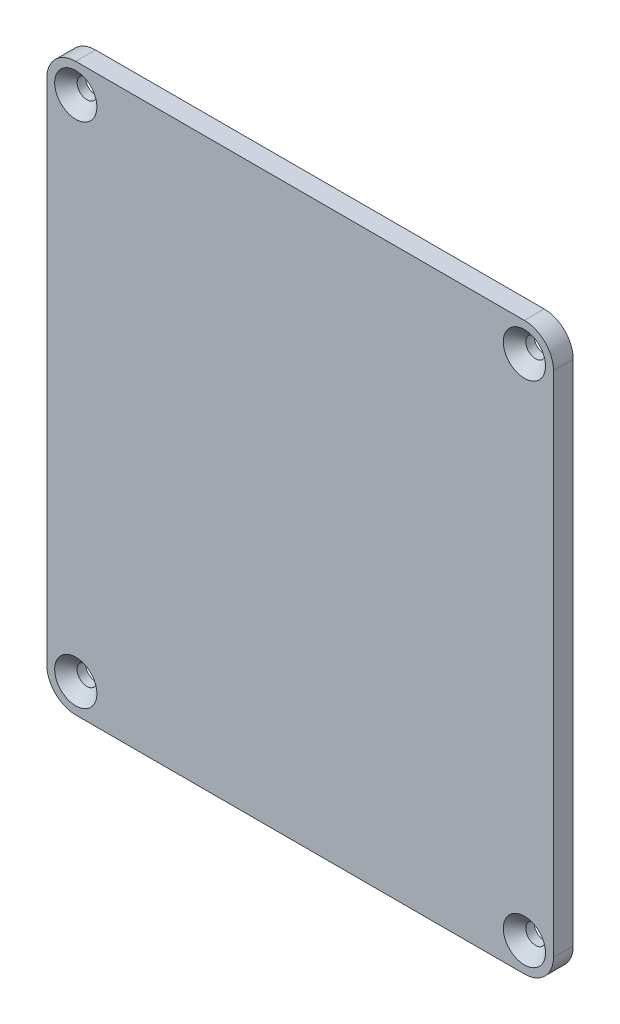
ISO-10303-21;
HEADER;
FILE_DESCRIPTION(('STEP AP214'),'2;1');
FILE_NAME('part.step','',(''),(''),'','','');
FILE_SCHEMA(('AUTOMOTIVE_DESIGN { 1 0 10303 214 1 1 1 1 }'));
ENDSEC;
DATA;
#1=APPLICATION_CONTEXT('core data for automotive mechanical design processes');
#2=APPLICATION_PROTOCOL_DEFINITION('international standard','automotive_design',2000,#1);
#3=PRODUCT_CONTEXT('',#1,'mechanical');
#4=PRODUCT('Part','Part','',(#3));
#5=PRODUCT_RELATED_PRODUCT_CATEGORY('part','',(#4));
#6=PRODUCT_DEFINITION_FORMATION('','',#4);
#7=PRODUCT_DEFINITION_CONTEXT('part definition',#1,'design');
#8=PRODUCT_DEFINITION('design','',#6,#7);
#9=PRODUCT_DEFINITION_SHAPE('','',#8);
#10=(LENGTH_UNIT() NAMED_UNIT(*) SI_UNIT(.MILLI.,.METRE.));
#11=(NAMED_UNIT(*) PLANE_ANGLE_UNIT() SI_UNIT($,.RADIAN.));
#12=(NAMED_UNIT(*) SI_UNIT($,.STERADIAN.) SOLID_ANGLE_UNIT());
#13=UNCERTAINTY_MEASURE_WITH_UNIT(LENGTH_MEASURE(1.E-05),#10,'distance_accuracy_value','');
#14=(GEOMETRIC_REPRESENTATION_CONTEXT(3) GLOBAL_UNCERTAINTY_ASSIGNED_CONTEXT((#13)) GLOBAL_UNIT_ASSIGNED_CONTEXT((#10,
#11,#12)) REPRESENTATION_CONTEXT('',''));
#15=CARTESIAN_POINT('',(0.,0.,0.));
#16=DIRECTION('',(0.,0.,1.));
#17=DIRECTION('',(1.,0.,0.));
#18=AXIS2_PLACEMENT_3D('',#15,#16,#17);
#19=CARTESIAN_POINT('',(34.,-38.5,3.));
#20=DIRECTION('',(0.,0.,1.));
#21=DIRECTION('',(1.,0.,0.));
#22=AXIS2_PLACEMENT_3D('',#19,#20,#21);
#23=PLANE('',#22);
#24=CARTESIAN_POINT('',(34.,-38.5,3.));
#25=DIRECTION('',(0.,0.,1.));
#26=DIRECTION('',(1.,0.,0.));
#27=AXIS2_PLACEMENT_3D('',#24,#25,#26);
#28=CIRCLE('',#27,3.20000000000001);
#29=CARTESIAN_POINT('',(37.2,-38.5,3.));
#30=VERTEX_POINT('',#29);
#31=EDGE_CURVE('E197',#30,#30,#28,.F.);
#32=ORIENTED_EDGE('',*,*,#31,.T.);
#33=EDGE_LOOP('',(#32));
#34=FACE_BOUND('',#33,.T.);
#35=CARTESIAN_POINT('',(34.,38.5,3.));
#36=DIRECTION('',(0.,0.,1.));
#37=DIRECTION('',(1.,0.,0.));
#38=AXIS2_PLACEMENT_3D('',#35,#36,#37);
#39=CIRCLE('',#38,3.20000000000001);
#40=CARTESIAN_POINT('',(37.2,38.5,3.));
#41=VERTEX_POINT('',#40);
#42=EDGE_CURVE('E193',#41,#41,#39,.F.);
#43=ORIENTED_EDGE('',*,*,#42,.T.);
#44=EDGE_LOOP('',(#43));
#45=FACE_BOUND('',#44,.T.);
#46=CARTESIAN_POINT('',(-34.,38.5,3.));
#47=DIRECTION('',(0.,0.,1.));
#48=DIRECTION('',(1.,0.,0.));
#49=AXIS2_PLACEMENT_3D('',#46,#47,#48);
#50=CIRCLE('',#49,3.20000000000001);
#51=CARTESIAN_POINT('',(-30.8,38.5,3.));
#52=VERTEX_POINT('',#51);
#53=EDGE_CURVE('E189',#52,#52,#50,.F.);
#54=ORIENTED_EDGE('',*,*,#53,.T.);
#55=EDGE_LOOP('',(#54));
#56=FACE_BOUND('',#55,.T.);
#57=CARTESIAN_POINT('',(-34.,-38.5,3.));
#58=DIRECTION('',(0.,0.,1.));
#59=DIRECTION('',(1.,0.,0.));
#60=AXIS2_PLACEMENT_3D('',#57,#58,#59);
#61=CIRCLE('',#60,3.20000000000001);
#62=CARTESIAN_POINT('',(-30.8,-38.5,3.));
#63=VERTEX_POINT('',#62);
#64=EDGE_CURVE('E186',#63,#63,#61,.F.);
#65=ORIENTED_EDGE('',*,*,#64,.T.);
#66=EDGE_LOOP('',(#65));
#67=FACE_BOUND('',#66,.T.);
#68=CARTESIAN_POINT('',(34.,-38.5,3.));
#69=DIRECTION('',(0.,0.,1.));
#70=DIRECTION('',(1.,0.,0.));
#71=AXIS2_PLACEMENT_3D('',#68,#69,#70);
#72=CIRCLE('',#71,4.39999999999999);
#73=CARTESIAN_POINT('',(34.,-42.9,3.));
#74=VERTEX_POINT('',#73);
#75=CARTESIAN_POINT('',(38.4,-38.5,3.));
#76=VERTEX_POINT('',#75);
#77=EDGE_CURVE('E166',#74,#76,#72,.T.);
#78=ORIENTED_EDGE('',*,*,#77,.T.);
#79=DIRECTION('',(0.,1.,0.));
#80=VECTOR('',#79,1.);
#81=CARTESIAN_POINT('',(38.4,-38.5,3.));
#82=LINE('',#81,#80);
#83=CARTESIAN_POINT('',(38.4,38.5,3.));
#84=VERTEX_POINT('',#83);
#85=EDGE_CURVE('E107',#76,#84,#82,.T.);
#86=ORIENTED_EDGE('',*,*,#85,.T.);
#87=CARTESIAN_POINT('',(34.,38.5,3.));
#88=DIRECTION('',(0.,0.,1.));
#89=DIRECTION('',(1.,0.,0.));
#90=AXIS2_PLACEMENT_3D('',#87,#88,#89);
#91=CIRCLE('',#90,4.39999999999999);
#92=CARTESIAN_POINT('',(34.,42.9,3.));
#93=VERTEX_POINT('',#92);
#94=EDGE_CURVE('E302',#84,#93,#91,.T.);
#95=ORIENTED_EDGE('',*,*,#94,.T.);
#96=DIRECTION('',(-1.,0.,0.));
#97=VECTOR('',#96,1.);
#98=CARTESIAN_POINT('',(34.,42.9,3.));
#99=LINE('',#98,#97);
#100=CARTESIAN_POINT('',(-34.,42.9,3.));
#101=VERTEX_POINT('',#100);
#102=EDGE_CURVE('E305',#93,#101,#99,.T.);
#103=ORIENTED_EDGE('',*,*,#102,.T.);
#104=CARTESIAN_POINT('',(-34.,38.5,3.));
#105=DIRECTION('',(0.,0.,1.));
#106=DIRECTION('',(1.,0.,0.));
#107=AXIS2_PLACEMENT_3D('',#104,#105,#106);
#108=CIRCLE('',#107,4.39999999999999);
#109=CARTESIAN_POINT('',(-38.4,38.5,3.));
#110=VERTEX_POINT('',#109);
#111=EDGE_CURVE('E127',#101,#110,#108,.T.);
#112=ORIENTED_EDGE('',*,*,#111,.T.);
#113=DIRECTION('',(0.,-1.,0.));
#114=VECTOR('',#113,1.);
#115=CARTESIAN_POINT('',(-38.4,38.5,3.));
#116=LINE('',#115,#114);
#117=CARTESIAN_POINT('',(-38.4,-38.5,3.));
#118=VERTEX_POINT('',#117);
#119=EDGE_CURVE('E122',#110,#118,#116,.T.);
#120=ORIENTED_EDGE('',*,*,#119,.T.);
#121=CARTESIAN_POINT('',(-34.,-38.5,3.));
#122=DIRECTION('',(0.,0.,1.));
#123=DIRECTION('',(1.,0.,0.));
#124=AXIS2_PLACEMENT_3D('',#121,#122,#123);
#125=CIRCLE('',#124,4.39999999999999);
#126=CARTESIAN_POINT('',(-34.,-42.9,3.));
#127=VERTEX_POINT('',#126);
#128=EDGE_CURVE('E125',#118,#127,#125,.T.);
#129=ORIENTED_EDGE('',*,*,#128,.T.);
#130=DIRECTION('',(1.,0.,0.));
#131=VECTOR('',#130,1.);
#132=CARTESIAN_POINT('',(-34.,-42.9,3.));
#133=LINE('',#132,#131);
#134=EDGE_CURVE('E61',#127,#74,#133,.T.);
#135=ORIENTED_EDGE('',*,*,#134,.T.);
#136=EDGE_LOOP('',(#78,#86,#95,#103,#112,#120,#129,#135));
#137=FACE_BOUND('',#136,.T.);
#138=ADVANCED_FACE('F43',(#34,#45,#56,#67,#137),#23,.T.);
#139=CARTESIAN_POINT('',(34.,-38.5,0.));
#140=DIRECTION('',(0.,0.,1.));
#141=DIRECTION('',(1.,0.,0.));
#142=AXIS2_PLACEMENT_3D('',#139,#140,#141);
#143=PLANE('',#142);
#144=CARTESIAN_POINT('',(34.,-38.5,0.));
#145=DIRECTION('',(0.,0.,1.));
#146=DIRECTION('',(1.,0.,0.));
#147=AXIS2_PLACEMENT_3D('',#144,#145,#146);
#148=CIRCLE('',#147,4.39999999999999);
#149=CARTESIAN_POINT('',(34.,-42.9,0.));
#150=VERTEX_POINT('',#149);
#151=CARTESIAN_POINT('',(38.4,-38.5,0.));
#152=VERTEX_POINT('',#151);
#153=EDGE_CURVE('E146',#150,#152,#148,.T.);
#154=ORIENTED_EDGE('',*,*,#153,.F.);
#155=DIRECTION('',(1.,0.,0.));
#156=VECTOR('',#155,1.);
#157=CARTESIAN_POINT('',(-34.,-42.9,0.));
#158=LINE('',#157,#156);
#159=CARTESIAN_POINT('',(-34.,-42.9,0.));
#160=VERTEX_POINT('',#159);
#161=EDGE_CURVE('E98',#160,#150,#158,.T.);
#162=ORIENTED_EDGE('',*,*,#161,.F.);
#163=CARTESIAN_POINT('',(-34.,-38.5,0.));
#164=DIRECTION('',(0.,0.,1.));
#165=DIRECTION('',(1.,0.,0.));
#166=AXIS2_PLACEMENT_3D('',#163,#164,#165);
#167=CIRCLE('',#166,4.39999999999999);
#168=CARTESIAN_POINT('',(-38.4,-38.5,0.));
#169=VERTEX_POINT('',#168);
#170=EDGE_CURVE('E92',#169,#160,#167,.T.);
#171=ORIENTED_EDGE('',*,*,#170,.F.);
#172=DIRECTION('',(0.,-1.,0.));
#173=VECTOR('',#172,1.);
#174=CARTESIAN_POINT('',(-38.4,38.5,0.));
#175=LINE('',#174,#173);
#176=CARTESIAN_POINT('',(-38.4,38.5,0.));
#177=VERTEX_POINT('',#176);
#178=EDGE_CURVE('E135',#177,#169,#175,.T.);
#179=ORIENTED_EDGE('',*,*,#178,.F.);
#180=CARTESIAN_POINT('',(-34.,38.5,0.));
#181=DIRECTION('',(0.,0.,1.));
#182=DIRECTION('',(1.,0.,0.));
#183=AXIS2_PLACEMENT_3D('',#180,#181,#182);
#184=CIRCLE('',#183,4.39999999999999);
#185=CARTESIAN_POINT('',(-34.,42.9,0.));
#186=VERTEX_POINT('',#185);
#187=EDGE_CURVE('E159',#186,#177,#184,.T.);
#188=ORIENTED_EDGE('',*,*,#187,.F.);
#189=DIRECTION('',(-1.,0.,0.));
#190=VECTOR('',#189,1.);
#191=CARTESIAN_POINT('',(34.,42.9,0.));
#192=LINE('',#191,#190);
#193=CARTESIAN_POINT('',(34.,42.9,0.));
#194=VERTEX_POINT('',#193);
#195=EDGE_CURVE('E156',#194,#186,#192,.T.);
#196=ORIENTED_EDGE('',*,*,#195,.F.);
#197=CARTESIAN_POINT('',(34.,38.5,0.));
#198=DIRECTION('',(0.,0.,1.));
#199=DIRECTION('',(1.,0.,0.));
#200=AXIS2_PLACEMENT_3D('',#197,#198,#199);
#201=CIRCLE('',#200,4.39999999999999);
#202=CARTESIAN_POINT('',(38.4,38.5,0.));
#203=VERTEX_POINT('',#202);
#204=EDGE_CURVE('E153',#203,#194,#201,.T.);
#205=ORIENTED_EDGE('',*,*,#204,.F.);
#206=DIRECTION('',(0.,1.,0.));
#207=VECTOR('',#206,1.);
#208=CARTESIAN_POINT('',(38.4,-38.5,0.));
#209=LINE('',#208,#207);
#210=EDGE_CURVE('E149',#152,#203,#209,.T.);
#211=ORIENTED_EDGE('',*,*,#210,.F.);
#212=EDGE_LOOP('',(#154,#162,#171,#179,#188,#196,#205,#211));
#213=FACE_BOUND('',#212,.T.);
#214=CARTESIAN_POINT('',(34.,-38.5,0.));
#215=DIRECTION('',(0.,0.,1.));
#216=DIRECTION('',(1.,0.,0.));
#217=AXIS2_PLACEMENT_3D('',#214,#215,#216);
#218=CIRCLE('',#217,1.5);
#219=CARTESIAN_POINT('',(35.5,-38.5,0.));
#220=VERTEX_POINT('',#219);
#221=EDGE_CURVE('E150',#220,#220,#218,.T.);
#222=ORIENTED_EDGE('',*,*,#221,.T.);
#223=EDGE_LOOP('',(#222));
#224=FACE_BOUND('',#223,.T.);
#225=CARTESIAN_POINT('',(-34.,-38.5,0.));
#226=DIRECTION('',(0.,0.,1.));
#227=DIRECTION('',(-1.,0.,0.));
#228=AXIS2_PLACEMENT_3D('',#225,#226,#227);
#229=CIRCLE('',#228,1.5);
#230=CARTESIAN_POINT('',(-35.5,-38.5,0.));
#231=VERTEX_POINT('',#230);
#232=EDGE_CURVE('E292',#231,#231,#229,.T.);
#233=ORIENTED_EDGE('',*,*,#232,.T.);
#234=EDGE_LOOP('',(#233));
#235=FACE_BOUND('',#234,.T.);
#236=CARTESIAN_POINT('',(34.,38.5,0.));
#237=DIRECTION('',(0.,0.,1.));
#238=DIRECTION('',(-1.,0.,0.));
#239=AXIS2_PLACEMENT_3D('',#236,#237,#238);
#240=CIRCLE('',#239,1.5);
#241=CARTESIAN_POINT('',(32.5,38.5,0.));
#242=VERTEX_POINT('',#241);
#243=EDGE_CURVE('E295',#242,#242,#240,.T.);
#244=ORIENTED_EDGE('',*,*,#243,.T.);
#245=EDGE_LOOP('',(#244));
#246=FACE_BOUND('',#245,.T.);
#247=CARTESIAN_POINT('',(-34.,38.5,0.));
#248=DIRECTION('',(0.,0.,1.));
#249=DIRECTION('',(1.,0.,0.));
#250=AXIS2_PLACEMENT_3D('',#247,#248,#249);
#251=CIRCLE('',#250,1.5);
#252=CARTESIAN_POINT('',(-32.5,38.5,0.));
#253=VERTEX_POINT('',#252);
#254=EDGE_CURVE('E308',#253,#253,#251,.T.);
#255=ORIENTED_EDGE('',*,*,#254,.T.);
#256=EDGE_LOOP('',(#255));
#257=FACE_BOUND('',#256,.T.);
#258=ADVANCED_FACE('F226',(#213,#224,#235,#246,#257),#143,.F.);
#259=CARTESIAN_POINT('',(34.,-38.5,3.));
#260=DIRECTION('',(0.,0.,-1.));
#261=DIRECTION('',(-1.,0.,0.));
#262=AXIS2_PLACEMENT_3D('',#259,#260,#261);
#263=CYLINDRICAL_SURFACE('',#262,4.39999999999999);
#264=ORIENTED_EDGE('',*,*,#153,.T.);
#265=DIRECTION('',(0.,0.,-1.));
#266=VECTOR('',#265,1.);
#267=CARTESIAN_POINT('',(38.4,-38.5,3.));
#268=LINE('',#267,#266);
#269=EDGE_CURVE('E181',#76,#152,#268,.T.);
#270=ORIENTED_EDGE('',*,*,#269,.F.);
#271=ORIENTED_EDGE('',*,*,#77,.F.);
#272=DIRECTION('',(0.,0.,-1.));
#273=VECTOR('',#272,1.);
#274=CARTESIAN_POINT('',(34.,-42.9,3.));
#275=LINE('',#274,#273);
#276=EDGE_CURVE('E142',#74,#150,#275,.T.);
#277=ORIENTED_EDGE('',*,*,#276,.T.);
#278=EDGE_LOOP('',(#264,#270,#271,#277));
#279=FACE_BOUND('',#278,.T.);
#280=ADVANCED_FACE('F232',(#279),#263,.T.);
#281=CARTESIAN_POINT('',(38.4,-38.5,3.));
#282=DIRECTION('',(-1.,0.,0.));
#283=DIRECTION('',(0.,0.,1.));
#284=AXIS2_PLACEMENT_3D('',#281,#282,#283);
#285=PLANE('',#284);
#286=ORIENTED_EDGE('',*,*,#210,.T.);
#287=DIRECTION('',(0.,0.,-1.));
#288=VECTOR('',#287,1.);
#289=CARTESIAN_POINT('',(38.4,38.5,3.));
#290=LINE('',#289,#288);
#291=EDGE_CURVE('E178',#84,#203,#290,.T.);
#292=ORIENTED_EDGE('',*,*,#291,.F.);
#293=ORIENTED_EDGE('',*,*,#85,.F.);
#294=ORIENTED_EDGE('',*,*,#269,.T.);
#295=EDGE_LOOP('',(#286,#292,#293,#294));
#296=FACE_BOUND('',#295,.T.);
#297=ADVANCED_FACE('F258',(#296),#285,.F.);
#298=CARTESIAN_POINT('',(34.,38.5,3.));
#299=DIRECTION('',(0.,0.,-1.));
#300=DIRECTION('',(-1.,0.,0.));
#301=AXIS2_PLACEMENT_3D('',#298,#299,#300);
#302=CYLINDRICAL_SURFACE('',#301,4.39999999999999);
#303=ORIENTED_EDGE('',*,*,#204,.T.);
#304=DIRECTION('',(0.,0.,-1.));
#305=VECTOR('',#304,1.);
#306=CARTESIAN_POINT('',(34.,42.9,3.));
#307=LINE('',#306,#305);
#308=EDGE_CURVE('E174',#93,#194,#307,.T.);
#309=ORIENTED_EDGE('',*,*,#308,.F.);
#310=ORIENTED_EDGE('',*,*,#94,.F.);
#311=ORIENTED_EDGE('',*,*,#291,.T.);
#312=EDGE_LOOP('',(#303,#309,#310,#311));
#313=FACE_BOUND('',#312,.T.);
#314=ADVANCED_FACE('F254',(#313),#302,.T.);
#315=CARTESIAN_POINT('',(34.,42.9,3.));
#316=DIRECTION('',(0.,-1.,0.));
#317=DIRECTION('',(0.,0.,-1.));
#318=AXIS2_PLACEMENT_3D('',#315,#316,#317);
#319=PLANE('',#318);
#320=ORIENTED_EDGE('',*,*,#195,.T.);
#321=DIRECTION('',(0.,0.,-1.));
#322=VECTOR('',#321,1.);
#323=CARTESIAN_POINT('',(-34.,42.9,3.));
#324=LINE('',#323,#322);
#325=EDGE_CURVE('E170',#101,#186,#324,.T.);
#326=ORIENTED_EDGE('',*,*,#325,.F.);
#327=ORIENTED_EDGE('',*,*,#102,.F.);
#328=ORIENTED_EDGE('',*,*,#308,.T.);
#329=EDGE_LOOP('',(#320,#326,#327,#328));
#330=FACE_BOUND('',#329,.T.);
#331=ADVANCED_FACE('F250',(#330),#319,.F.);
#332=CARTESIAN_POINT('',(-34.,38.5,3.));
#333=DIRECTION('',(0.,0.,-1.));
#334=DIRECTION('',(-1.,0.,0.));
#335=AXIS2_PLACEMENT_3D('',#332,#333,#334);
#336=CYLINDRICAL_SURFACE('',#335,4.39999999999999);
#337=ORIENTED_EDGE('',*,*,#187,.T.);
#338=DIRECTION('',(0.,0.,-1.));
#339=VECTOR('',#338,1.);
#340=CARTESIAN_POINT('',(-38.4,38.5,3.));
#341=LINE('',#340,#339);
#342=EDGE_CURVE('E136',#110,#177,#341,.T.);
#343=ORIENTED_EDGE('',*,*,#342,.F.);
#344=ORIENTED_EDGE('',*,*,#111,.F.);
#345=ORIENTED_EDGE('',*,*,#325,.T.);
#346=EDGE_LOOP('',(#337,#343,#344,#345));
#347=FACE_BOUND('',#346,.T.);
#348=ADVANCED_FACE('F247',(#347),#336,.T.);
#349=CARTESIAN_POINT('',(-38.4,38.5,3.));
#350=DIRECTION('',(1.,0.,0.));
#351=DIRECTION('',(0.,0.,-1.));
#352=AXIS2_PLACEMENT_3D('',#349,#350,#351);
#353=PLANE('',#352);
#354=ORIENTED_EDGE('',*,*,#178,.T.);
#355=DIRECTION('',(0.,0.,-1.));
#356=VECTOR('',#355,1.);
#357=CARTESIAN_POINT('',(-38.4,-38.5,3.));
#358=LINE('',#357,#356);
#359=EDGE_CURVE('E132',#118,#169,#358,.T.);
#360=ORIENTED_EDGE('',*,*,#359,.F.);
#361=ORIENTED_EDGE('',*,*,#119,.F.);
#362=ORIENTED_EDGE('',*,*,#342,.T.);
#363=EDGE_LOOP('',(#354,#360,#361,#362));
#364=FACE_BOUND('',#363,.T.);
#365=ADVANCED_FACE('F133',(#364),#353,.F.);
#366=CARTESIAN_POINT('',(-34.,-38.5,3.));
#367=DIRECTION('',(0.,0.,-1.));
#368=DIRECTION('',(-1.,0.,0.));
#369=AXIS2_PLACEMENT_3D('',#366,#367,#368);
#370=CYLINDRICAL_SURFACE('',#369,4.39999999999999);
#371=ORIENTED_EDGE('',*,*,#170,.T.);
#372=DIRECTION('',(0.,0.,-1.));
#373=VECTOR('',#372,1.);
#374=CARTESIAN_POINT('',(-34.,-42.9,3.));
#375=LINE('',#374,#373);
#376=EDGE_CURVE('E137',#127,#160,#375,.T.);
#377=ORIENTED_EDGE('',*,*,#376,.F.);
#378=ORIENTED_EDGE('',*,*,#128,.F.);
#379=ORIENTED_EDGE('',*,*,#359,.T.);
#380=EDGE_LOOP('',(#371,#377,#378,#379));
#381=FACE_BOUND('',#380,.T.);
#382=ADVANCED_FACE('F139',(#381),#370,.T.);
#383=CARTESIAN_POINT('',(-34.,-42.9,3.));
#384=DIRECTION('',(0.,1.,0.));
#385=DIRECTION('',(0.,0.,1.));
#386=AXIS2_PLACEMENT_3D('',#383,#384,#385);
#387=PLANE('',#386);
#388=ORIENTED_EDGE('',*,*,#161,.T.);
#389=ORIENTED_EDGE('',*,*,#276,.F.);
#390=ORIENTED_EDGE('',*,*,#134,.F.);
#391=ORIENTED_EDGE('',*,*,#376,.T.);
#392=EDGE_LOOP('',(#388,#389,#390,#391));
#393=FACE_BOUND('',#392,.T.);
#394=ADVANCED_FACE('F240',(#393),#387,.F.);
#395=CARTESIAN_POINT('',(34.,-38.5,3.));
#396=DIRECTION('',(0.,0.,-1.));
#397=DIRECTION('',(-1.,0.,0.));
#398=AXIS2_PLACEMENT_3D('',#395,#396,#397);
#399=CYLINDRICAL_SURFACE('',#398,1.5);
#400=CARTESIAN_POINT('',(34.,-38.5,1.3));
#401=DIRECTION('',(0.,0.,1.));
#402=DIRECTION('',(1.,0.,0.));
#403=AXIS2_PLACEMENT_3D('',#400,#401,#402);
#404=CIRCLE('',#403,1.5);
#405=CARTESIAN_POINT('',(35.5,-38.5,1.3));
#406=VERTEX_POINT('',#405);
#407=EDGE_CURVE('E183',#406,#406,#404,.T.);
#408=ORIENTED_EDGE('',*,*,#407,.T.);
#409=EDGE_LOOP('',(#408));
#410=FACE_BOUND('',#409,.T.);
#411=ORIENTED_EDGE('',*,*,#221,.F.);
#412=EDGE_LOOP('',(#411));
#413=FACE_BOUND('',#412,.T.);
#414=ADVANCED_FACE('F237',(#410,#413),#399,.F.);
#415=CARTESIAN_POINT('',(-34.,-38.5,3.));
#416=DIRECTION('',(0.,0.,-1.));
#417=DIRECTION('',(-1.,0.,0.));
#418=AXIS2_PLACEMENT_3D('',#415,#416,#417);
#419=CYLINDRICAL_SURFACE('',#418,1.5);
#420=CARTESIAN_POINT('',(-34.,-38.5,1.3));
#421=DIRECTION('',(0.,0.,1.));
#422=DIRECTION('',(1.,0.,0.));
#423=AXIS2_PLACEMENT_3D('',#420,#421,#422);
#424=CIRCLE('',#423,1.5);
#425=CARTESIAN_POINT('',(-32.5,-38.5,1.3));
#426=VERTEX_POINT('',#425);
#427=EDGE_CURVE('E11',#426,#426,#424,.T.);
#428=ORIENTED_EDGE('',*,*,#427,.T.);
#429=EDGE_LOOP('',(#428));
#430=FACE_BOUND('',#429,.T.);
#431=ORIENTED_EDGE('',*,*,#232,.F.);
#432=EDGE_LOOP('',(#431));
#433=FACE_BOUND('',#432,.T.);
#434=ADVANCED_FACE('F288',(#430,#433),#419,.F.);
#435=CARTESIAN_POINT('',(34.,38.5,3.));
#436=DIRECTION('',(0.,0.,-1.));
#437=DIRECTION('',(-1.,0.,0.));
#438=AXIS2_PLACEMENT_3D('',#435,#436,#437);
#439=CYLINDRICAL_SURFACE('',#438,1.5);
#440=CARTESIAN_POINT('',(34.,38.5,1.3));
#441=DIRECTION('',(0.,0.,1.));
#442=DIRECTION('',(1.,0.,0.));
#443=AXIS2_PLACEMENT_3D('',#440,#441,#442);
#444=CIRCLE('',#443,1.5);
#445=CARTESIAN_POINT('',(35.5,38.5,1.3));
#446=VERTEX_POINT('',#445);
#447=EDGE_CURVE('E200',#446,#446,#444,.T.);
#448=ORIENTED_EDGE('',*,*,#447,.T.);
#449=EDGE_LOOP('',(#448));
#450=FACE_BOUND('',#449,.T.);
#451=ORIENTED_EDGE('',*,*,#243,.F.);
#452=EDGE_LOOP('',(#451));
#453=FACE_BOUND('',#452,.T.);
#454=ADVANCED_FACE('F280',(#450,#453),#439,.F.);
#455=CARTESIAN_POINT('',(-34.,38.5,3.));
#456=DIRECTION('',(0.,0.,-1.));
#457=DIRECTION('',(-1.,0.,0.));
#458=AXIS2_PLACEMENT_3D('',#455,#456,#457);
#459=CYLINDRICAL_SURFACE('',#458,1.5);
#460=CARTESIAN_POINT('',(-34.,38.5,1.3));
#461=DIRECTION('',(0.,0.,1.));
#462=DIRECTION('',(1.,0.,0.));
#463=AXIS2_PLACEMENT_3D('',#460,#461,#462);
#464=CIRCLE('',#463,1.5);
#465=CARTESIAN_POINT('',(-32.5,38.5,1.3));
#466=VERTEX_POINT('',#465);
#467=EDGE_CURVE('E53',#466,#466,#464,.T.);
#468=ORIENTED_EDGE('',*,*,#467,.T.);
#469=EDGE_LOOP('',(#468));
#470=FACE_BOUND('',#469,.T.);
#471=ORIENTED_EDGE('',*,*,#254,.F.);
#472=EDGE_LOOP('',(#471));
#473=FACE_BOUND('',#472,.T.);
#474=ADVANCED_FACE('F208',(#470,#473),#459,.F.);
#475=CARTESIAN_POINT('',(34.,-38.5,1.3));
#476=DIRECTION('',(0.,0.,1.));
#477=DIRECTION('',(1.,0.,0.));
#478=AXIS2_PLACEMENT_3D('',#475,#476,#477);
#479=CONICAL_SURFACE('',#478,1.5,0.785398163397452);
#480=CARTESIAN_POINT('',(37.2,-38.5,3.));
#481=CARTESIAN_POINT('',(37.1822916666667,-38.5,2.98229166666667));
#482=CARTESIAN_POINT('',(37.1645833333333,-38.5,2.96458333333333));
#483=CARTESIAN_POINT('',(37.1291666666667,-38.5,2.92916666666667));
#484=CARTESIAN_POINT('',(37.1114583333333,-38.5,2.91145833333333));
#485=CARTESIAN_POINT('',(37.0760416666667,-38.5,2.87604166666667));
#486=CARTESIAN_POINT('',(37.0583333333333,-38.5,2.85833333333333));
#487=CARTESIAN_POINT('',(37.0229166666667,-38.5,2.82291666666667));
#488=CARTESIAN_POINT('',(37.0052083333333,-38.5,2.80520833333333));
#489=CARTESIAN_POINT('',(36.9697916666667,-38.5,2.76979166666667));
#490=CARTESIAN_POINT('',(36.9520833333333,-38.5,2.75208333333333));
#491=CARTESIAN_POINT('',(36.9166666666667,-38.5,2.71666666666667));
#492=CARTESIAN_POINT('',(36.8989583333333,-38.5,2.69895833333333));
#493=CARTESIAN_POINT('',(36.8635416666667,-38.5,2.66354166666667));
#494=CARTESIAN_POINT('',(36.8458333333333,-38.5,2.64583333333333));
#495=CARTESIAN_POINT('',(36.8104166666667,-38.5,2.61041666666667));
#496=CARTESIAN_POINT('',(36.7927083333333,-38.5,2.59270833333333));
#497=CARTESIAN_POINT('',(36.7572916666667,-38.5,2.55729166666667));
#498=CARTESIAN_POINT('',(36.7395833333333,-38.5,2.53958333333333));
#499=CARTESIAN_POINT('',(36.7041666666667,-38.5,2.50416666666667));
#500=CARTESIAN_POINT('',(36.6864583333333,-38.5,2.48645833333333));
#501=CARTESIAN_POINT('',(36.6510416666667,-38.5,2.45104166666667));
#502=CARTESIAN_POINT('',(36.6333333333333,-38.5,2.43333333333333));
#503=CARTESIAN_POINT('',(36.5979166666667,-38.5,2.39791666666667));
#504=CARTESIAN_POINT('',(36.5802083333333,-38.5,2.38020833333333));
#505=CARTESIAN_POINT('',(36.5447916666667,-38.5,2.34479166666667));
#506=CARTESIAN_POINT('',(36.5270833333333,-38.5,2.32708333333333));
#507=CARTESIAN_POINT('',(36.4916666666667,-38.5,2.29166666666667));
#508=CARTESIAN_POINT('',(36.4739583333333,-38.5,2.27395833333334));
#509=CARTESIAN_POINT('',(36.4385416666667,-38.5,2.23854166666667));
#510=CARTESIAN_POINT('',(36.4208333333333,-38.5,2.22083333333333));
#511=CARTESIAN_POINT('',(36.3854166666667,-38.5,2.18541666666667));
#512=CARTESIAN_POINT('',(36.3677083333333,-38.5,2.16770833333334));
#513=CARTESIAN_POINT('',(36.3322916666667,-38.5,2.13229166666667));
#514=CARTESIAN_POINT('',(36.3145833333333,-38.5,2.11458333333333));
#515=CARTESIAN_POINT('',(36.2791666666667,-38.5,2.07916666666667));
#516=CARTESIAN_POINT('',(36.2614583333333,-38.5,2.06145833333334));
#517=CARTESIAN_POINT('',(36.2260416666667,-38.5,2.02604166666667));
#518=CARTESIAN_POINT('',(36.2083333333333,-38.5,2.00833333333334));
#519=CARTESIAN_POINT('',(36.1729166666667,-38.5,1.97291666666667));
#520=CARTESIAN_POINT('',(36.1552083333333,-38.5,1.95520833333334));
#521=CARTESIAN_POINT('',(36.1197916666667,-38.5,1.91979166666667));
#522=CARTESIAN_POINT('',(36.1020833333333,-38.5,1.90208333333334));
#523=CARTESIAN_POINT('',(36.0666666666667,-38.5,1.86666666666667));
#524=CARTESIAN_POINT('',(36.0489583333333,-38.5,1.84895833333334));
#525=CARTESIAN_POINT('',(36.0135416666667,-38.5,1.81354166666667));
#526=CARTESIAN_POINT('',(35.9958333333333,-38.5,1.79583333333334));
#527=CARTESIAN_POINT('',(35.9604166666667,-38.5,1.76041666666667));
#528=CARTESIAN_POINT('',(35.9427083333333,-38.5,1.74270833333334));
#529=CARTESIAN_POINT('',(35.9072916666667,-38.5,1.70729166666667));
#530=CARTESIAN_POINT('',(35.8895833333333,-38.5,1.68958333333334));
#531=CARTESIAN_POINT('',(35.8541666666667,-38.5,1.65416666666667));
#532=CARTESIAN_POINT('',(35.8364583333333,-38.5,1.63645833333334));
#533=CARTESIAN_POINT('',(35.8010416666667,-38.5,1.60104166666667));
#534=CARTESIAN_POINT('',(35.7833333333333,-38.5,1.58333333333334));
#535=CARTESIAN_POINT('',(35.7479166666667,-38.5,1.54791666666667));
#536=CARTESIAN_POINT('',(35.7302083333333,-38.5,1.53020833333334));
#537=CARTESIAN_POINT('',(35.6947916666667,-38.5,1.49479166666667));
#538=CARTESIAN_POINT('',(35.6770833333333,-38.5,1.47708333333334));
#539=CARTESIAN_POINT('',(35.6416666666667,-38.5,1.44166666666667));
#540=CARTESIAN_POINT('',(35.6239583333333,-38.5,1.42395833333334));
#541=CARTESIAN_POINT('',(35.5885416666667,-38.5,1.38854166666667));
#542=CARTESIAN_POINT('',(35.5708333333333,-38.5,1.37083333333334));
#543=CARTESIAN_POINT('',(35.5354166666667,-38.5,1.33541666666667));
#544=CARTESIAN_POINT('',(35.5177083333333,-38.5,1.31770833333334));
#545=CARTESIAN_POINT('',(35.5,-38.5,1.3));
#546=B_SPLINE_CURVE_WITH_KNOTS('',3,(#480,#481,#482,#483,#484,#485,#486,#487,#488,#489,#490,
#491,#492,#493,#494,#495,#496,#497,#498,#499,#500,#501,#502,#503,#504,#505,#506,#507,#508,#509,
#510,#511,#512,#513,#514,#515,#516,#517,#518,#519,#520,#521,#522,#523,#524,#525,#526,#527,#528,
#529,#530,#531,#532,#533,#534,#535,#536,#537,#538,#539,#540,#541,#542,#543,#544,#545),
.UNSPECIFIED.,.F.,.F.,(4,2,2,2,2,2,2,2,2,2,2,2,2,2,2,2,2,2,2,2,2,2,2,2,2,2,2,2,2,2,2,2,4),(0.,
0.0751300955010667,0.150260191002138,0.225390286503209,0.300520382004281,0.375650477505352,
0.450780573006423,0.525910668507495,0.601040764008566,0.676170859509633,0.751300955010704,
0.826431050511775,0.901561146012847,0.976691241513918,1.05182133701499,1.12695143251606,
1.20208152801713,1.2772116235182,1.35234171901927,1.42747181452034,1.50260191002141,
1.57773200552248,1.65286210102356,1.72799219652463,1.8031222920257,1.87825238752676,
1.95338248302784,2.02851257852891,2.10364267402998,2.17877276953105,2.25390286503212,
2.32903296053319,2.40416305603426),.UNSPECIFIED.);
#547=EDGE_CURVE('BSEAM220',#30,#406,#546,.T.);
#548=ORIENTED_EDGE('',*,*,#31,.F.);
#549=ORIENTED_EDGE('',*,*,#407,.F.);
#550=ORIENTED_EDGE('',*,*,#547,.T.);
#551=ORIENTED_EDGE('',*,*,#547,.F.);
#552=EDGE_LOOP('',(#548,#550,#549,#551));
#553=FACE_BOUND('',#552,.T.);
#554=ADVANCED_FACE('F220',(#553),#479,.F.);
#555=CARTESIAN_POINT('',(34.,38.5,1.3));
#556=DIRECTION('',(0.,0.,1.));
#557=DIRECTION('',(1.,0.,0.));
#558=AXIS2_PLACEMENT_3D('',#555,#556,#557);
#559=CONICAL_SURFACE('',#558,1.5,0.785398163397451);
#560=CARTESIAN_POINT('',(37.2,38.5,3.));
#561=CARTESIAN_POINT('',(37.1822916666667,38.5,2.98229166666667));
#562=CARTESIAN_POINT('',(37.1645833333333,38.5,2.96458333333333));
#563=CARTESIAN_POINT('',(37.1291666666667,38.5,2.92916666666667));
#564=CARTESIAN_POINT('',(37.1114583333333,38.5,2.91145833333333));
#565=CARTESIAN_POINT('',(37.0760416666667,38.5,2.87604166666667));
#566=CARTESIAN_POINT('',(37.0583333333333,38.5,2.85833333333333));
#567=CARTESIAN_POINT('',(37.0229166666667,38.5,2.82291666666667));
#568=CARTESIAN_POINT('',(37.0052083333333,38.5,2.80520833333333));
#569=CARTESIAN_POINT('',(36.9697916666667,38.5,2.76979166666667));
#570=CARTESIAN_POINT('',(36.9520833333333,38.5,2.75208333333333));
#571=CARTESIAN_POINT('',(36.9166666666667,38.5,2.71666666666667));
#572=CARTESIAN_POINT('',(36.8989583333333,38.5,2.69895833333333));
#573=CARTESIAN_POINT('',(36.8635416666667,38.5,2.66354166666667));
#574=CARTESIAN_POINT('',(36.8458333333333,38.5,2.64583333333333));
#575=CARTESIAN_POINT('',(36.8104166666667,38.5,2.61041666666667));
#576=CARTESIAN_POINT('',(36.7927083333333,38.5,2.59270833333333));
#577=CARTESIAN_POINT('',(36.7572916666667,38.5,2.55729166666667));
#578=CARTESIAN_POINT('',(36.7395833333333,38.5,2.53958333333333));
#579=CARTESIAN_POINT('',(36.7041666666667,38.5,2.50416666666667));
#580=CARTESIAN_POINT('',(36.6864583333333,38.5,2.48645833333334));
#581=CARTESIAN_POINT('',(36.6510416666667,38.5,2.45104166666667));
#582=CARTESIAN_POINT('',(36.6333333333333,38.5,2.43333333333333));
#583=CARTESIAN_POINT('',(36.5979166666667,38.5,2.39791666666667));
#584=CARTESIAN_POINT('',(36.5802083333333,38.5,2.38020833333333));
#585=CARTESIAN_POINT('',(36.5447916666667,38.5,2.34479166666667));
#586=CARTESIAN_POINT('',(36.5270833333333,38.5,2.32708333333333));
#587=CARTESIAN_POINT('',(36.4916666666667,38.5,2.29166666666667));
#588=CARTESIAN_POINT('',(36.4739583333333,38.5,2.27395833333334));
#589=CARTESIAN_POINT('',(36.4385416666667,38.5,2.23854166666667));
#590=CARTESIAN_POINT('',(36.4208333333333,38.5,2.22083333333333));
#591=CARTESIAN_POINT('',(36.3854166666667,38.5,2.18541666666667));
#592=CARTESIAN_POINT('',(36.3677083333333,38.5,2.16770833333333));
#593=CARTESIAN_POINT('',(36.3322916666667,38.5,2.13229166666667));
#594=CARTESIAN_POINT('',(36.3145833333333,38.5,2.11458333333334));
#595=CARTESIAN_POINT('',(36.2791666666667,38.5,2.07916666666667));
#596=CARTESIAN_POINT('',(36.2614583333333,38.5,2.06145833333334));
#597=CARTESIAN_POINT('',(36.2260416666667,38.5,2.02604166666667));
#598=CARTESIAN_POINT('',(36.2083333333333,38.5,2.00833333333334));
#599=CARTESIAN_POINT('',(36.1729166666667,38.5,1.97291666666667));
#600=CARTESIAN_POINT('',(36.1552083333333,38.5,1.95520833333334));
#601=CARTESIAN_POINT('',(36.1197916666667,38.5,1.91979166666667));
#602=CARTESIAN_POINT('',(36.1020833333333,38.5,1.90208333333334));
#603=CARTESIAN_POINT('',(36.0666666666667,38.5,1.86666666666667));
#604=CARTESIAN_POINT('',(36.0489583333333,38.5,1.84895833333334));
#605=CARTESIAN_POINT('',(36.0135416666667,38.5,1.81354166666667));
#606=CARTESIAN_POINT('',(35.9958333333333,38.5,1.79583333333334));
#607=CARTESIAN_POINT('',(35.9604166666667,38.5,1.76041666666667));
#608=CARTESIAN_POINT('',(35.9427083333333,38.5,1.74270833333334));
#609=CARTESIAN_POINT('',(35.9072916666667,38.5,1.70729166666667));
#610=CARTESIAN_POINT('',(35.8895833333333,38.5,1.68958333333334));
#611=CARTESIAN_POINT('',(35.8541666666667,38.5,1.65416666666667));
#612=CARTESIAN_POINT('',(35.8364583333333,38.5,1.63645833333334));
#613=CARTESIAN_POINT('',(35.8010416666667,38.5,1.60104166666667));
#614=CARTESIAN_POINT('',(35.7833333333333,38.5,1.58333333333334));
#615=CARTESIAN_POINT('',(35.7479166666667,38.5,1.54791666666667));
#616=CARTESIAN_POINT('',(35.7302083333333,38.5,1.53020833333334));
#617=CARTESIAN_POINT('',(35.6947916666667,38.5,1.49479166666667));
#618=CARTESIAN_POINT('',(35.6770833333333,38.5,1.47708333333334));
#619=CARTESIAN_POINT('',(35.6416666666667,38.5,1.44166666666667));
#620=CARTESIAN_POINT('',(35.6239583333333,38.5,1.42395833333334));
#621=CARTESIAN_POINT('',(35.5885416666667,38.5,1.38854166666667));
#622=CARTESIAN_POINT('',(35.5708333333333,38.5,1.37083333333334));
#623=CARTESIAN_POINT('',(35.5354166666667,38.5,1.33541666666667));
#624=CARTESIAN_POINT('',(35.5177083333333,38.5,1.31770833333334));
#625=CARTESIAN_POINT('',(35.5,38.5,1.3));
#626=B_SPLINE_CURVE_WITH_KNOTS('',3,(#560,#561,#562,#563,#564,#565,#566,#567,#568,#569,#570,
#571,#572,#573,#574,#575,#576,#577,#578,#579,#580,#581,#582,#583,#584,#585,#586,#587,#588,#589,
#590,#591,#592,#593,#594,#595,#596,#597,#598,#599,#600,#601,#602,#603,#604,#605,#606,#607,#608,
#609,#610,#611,#612,#613,#614,#615,#616,#617,#618,#619,#620,#621,#622,#623,#624,#625),
.UNSPECIFIED.,.F.,.F.,(4,2,2,2,2,2,2,2,2,2,2,2,2,2,2,2,2,2,2,2,2,2,2,2,2,2,2,2,2,2,2,2,4),(0.,
0.0751300955010716,0.150260191002143,0.225390286503214,0.300520382004286,0.375650477505352,
0.450780573006423,0.525910668507495,0.601040764008566,0.676170859509638,0.751300955010709,
0.826431050511775,0.901561146012847,0.976691241513918,1.05182133701499,1.12695143251606,
1.20208152801713,1.2772116235182,1.35234171901927,1.42747181452034,1.50260191002141,
1.57773200552248,1.65286210102356,1.72799219652463,1.8031222920257,1.87825238752677,
1.95338248302784,2.02851257852891,2.10364267402998,2.17877276953105,2.25390286503212,
2.32903296053319,2.40416305603426),.UNSPECIFIED.);
#627=EDGE_CURVE('BSEAM213',#41,#446,#626,.T.);
#628=ORIENTED_EDGE('',*,*,#42,.F.);
#629=ORIENTED_EDGE('',*,*,#447,.F.);
#630=ORIENTED_EDGE('',*,*,#627,.T.);
#631=ORIENTED_EDGE('',*,*,#627,.F.);
#632=EDGE_LOOP('',(#628,#630,#629,#631));
#633=FACE_BOUND('',#632,.T.);
#634=ADVANCED_FACE('F213',(#633),#559,.F.);
#635=CARTESIAN_POINT('',(-34.,38.5,1.3));
#636=DIRECTION('',(0.,0.,1.));
#637=DIRECTION('',(1.,0.,0.));
#638=AXIS2_PLACEMENT_3D('',#635,#636,#637);
#639=CONICAL_SURFACE('',#638,1.5,0.785398163397451);
#640=CARTESIAN_POINT('',(-30.8,38.5,3.));
#641=CARTESIAN_POINT('',(-30.8177083333333,38.5,2.98229166666667));
#642=CARTESIAN_POINT('',(-30.8354166666667,38.5,2.96458333333333));
#643=CARTESIAN_POINT('',(-30.8708333333333,38.5,2.92916666666667));
#644=CARTESIAN_POINT('',(-30.8885416666667,38.5,2.91145833333333));
#645=CARTESIAN_POINT('',(-30.9239583333333,38.5,2.87604166666667));
#646=CARTESIAN_POINT('',(-30.9416666666667,38.5,2.85833333333333));
#647=CARTESIAN_POINT('',(-30.9770833333333,38.5,2.82291666666667));
#648=CARTESIAN_POINT('',(-30.9947916666667,38.5,2.80520833333333));
#649=CARTESIAN_POINT('',(-31.0302083333333,38.5,2.76979166666667));
#650=CARTESIAN_POINT('',(-31.0479166666667,38.5,2.75208333333333));
#651=CARTESIAN_POINT('',(-31.0833333333333,38.5,2.71666666666667));
#652=CARTESIAN_POINT('',(-31.1010416666667,38.5,2.69895833333333));
#653=CARTESIAN_POINT('',(-31.1364583333333,38.5,2.66354166666667));
#654=CARTESIAN_POINT('',(-31.1541666666667,38.5,2.64583333333333));
#655=CARTESIAN_POINT('',(-31.1895833333333,38.5,2.61041666666667));
#656=CARTESIAN_POINT('',(-31.2072916666667,38.5,2.59270833333333));
#657=CARTESIAN_POINT('',(-31.2427083333333,38.5,2.55729166666667));
#658=CARTESIAN_POINT('',(-31.2604166666667,38.5,2.53958333333333));
#659=CARTESIAN_POINT('',(-31.2958333333333,38.5,2.50416666666667));
#660=CARTESIAN_POINT('',(-31.3135416666667,38.5,2.48645833333334));
#661=CARTESIAN_POINT('',(-31.3489583333333,38.5,2.45104166666667));
#662=CARTESIAN_POINT('',(-31.3666666666667,38.5,2.43333333333333));
#663=CARTESIAN_POINT('',(-31.4020833333333,38.5,2.39791666666667));
#664=CARTESIAN_POINT('',(-31.4197916666667,38.5,2.38020833333333));
#665=CARTESIAN_POINT('',(-31.4552083333333,38.5,2.34479166666667));
#666=CARTESIAN_POINT('',(-31.4729166666667,38.5,2.32708333333333));
#667=CARTESIAN_POINT('',(-31.5083333333333,38.5,2.29166666666667));
#668=CARTESIAN_POINT('',(-31.5260416666667,38.5,2.27395833333334));
#669=CARTESIAN_POINT('',(-31.5614583333333,38.5,2.23854166666667));
#670=CARTESIAN_POINT('',(-31.5791666666667,38.5,2.22083333333333));
#671=CARTESIAN_POINT('',(-31.6145833333333,38.5,2.18541666666667));
#672=CARTESIAN_POINT('',(-31.6322916666667,38.5,2.16770833333333));
#673=CARTESIAN_POINT('',(-31.6677083333333,38.5,2.13229166666667));
#674=CARTESIAN_POINT('',(-31.6854166666667,38.5,2.11458333333334));
#675=CARTESIAN_POINT('',(-31.7208333333333,38.5,2.07916666666667));
#676=CARTESIAN_POINT('',(-31.7385416666667,38.5,2.06145833333334));
#677=CARTESIAN_POINT('',(-31.7739583333333,38.5,2.02604166666667));
#678=CARTESIAN_POINT('',(-31.7916666666667,38.5,2.00833333333334));
#679=CARTESIAN_POINT('',(-31.8270833333333,38.5,1.97291666666667));
#680=CARTESIAN_POINT('',(-31.8447916666667,38.5,1.95520833333334));
#681=CARTESIAN_POINT('',(-31.8802083333333,38.5,1.91979166666667));
#682=CARTESIAN_POINT('',(-31.8979166666667,38.5,1.90208333333334));
#683=CARTESIAN_POINT('',(-31.9333333333333,38.5,1.86666666666667));
#684=CARTESIAN_POINT('',(-31.9510416666667,38.5,1.84895833333334));
#685=CARTESIAN_POINT('',(-31.9864583333333,38.5,1.81354166666667));
#686=CARTESIAN_POINT('',(-32.0041666666667,38.5,1.79583333333334));
#687=CARTESIAN_POINT('',(-32.0395833333333,38.5,1.76041666666667));
#688=CARTESIAN_POINT('',(-32.0572916666667,38.5,1.74270833333334));
#689=CARTESIAN_POINT('',(-32.0927083333333,38.5,1.70729166666667));
#690=CARTESIAN_POINT('',(-32.1104166666667,38.5,1.68958333333334));
#691=CARTESIAN_POINT('',(-32.1458333333333,38.5,1.65416666666667));
#692=CARTESIAN_POINT('',(-32.1635416666667,38.5,1.63645833333334));
#693=CARTESIAN_POINT('',(-32.1989583333333,38.5,1.60104166666667));
#694=CARTESIAN_POINT('',(-32.2166666666667,38.5,1.58333333333334));
#695=CARTESIAN_POINT('',(-32.2520833333333,38.5,1.54791666666667));
#696=CARTESIAN_POINT('',(-32.2697916666667,38.5,1.53020833333334));
#697=CARTESIAN_POINT('',(-32.3052083333333,38.5,1.49479166666667));
#698=CARTESIAN_POINT('',(-32.3229166666667,38.5,1.47708333333334));
#699=CARTESIAN_POINT('',(-32.3583333333333,38.5,1.44166666666667));
#700=CARTESIAN_POINT('',(-32.3760416666667,38.5,1.42395833333334));
#701=CARTESIAN_POINT('',(-32.4114583333333,38.5,1.38854166666667));
#702=CARTESIAN_POINT('',(-32.4291666666667,38.5,1.37083333333334));
#703=CARTESIAN_POINT('',(-32.4645833333333,38.5,1.33541666666667));
#704=CARTESIAN_POINT('',(-32.4822916666667,38.5,1.31770833333334));
#705=CARTESIAN_POINT('',(-32.5,38.5,1.3));
#706=B_SPLINE_CURVE_WITH_KNOTS('',3,(#640,#641,#642,#643,#644,#645,#646,#647,#648,#649,#650,
#651,#652,#653,#654,#655,#656,#657,#658,#659,#660,#661,#662,#663,#664,#665,#666,#667,#668,#669,
#670,#671,#672,#673,#674,#675,#676,#677,#678,#679,#680,#681,#682,#683,#684,#685,#686,#687,#688,
#689,#690,#691,#692,#693,#694,#695,#696,#697,#698,#699,#700,#701,#702,#703,#704,#705),
.UNSPECIFIED.,.F.,.F.,(4,2,2,2,2,2,2,2,2,2,2,2,2,2,2,2,2,2,2,2,2,2,2,2,2,2,2,2,2,2,2,2,4),(0.,
0.0751300955010716,0.150260191002143,0.225390286503212,0.300520382004283,0.375650477505354,
0.450780573006423,0.525910668507495,0.601040764008566,0.676170859509638,0.751300955010709,
0.826431050511775,0.901561146012847,0.976691241513918,1.05182133701499,1.12695143251606,
1.20208152801713,1.2772116235182,1.35234171901927,1.42747181452034,1.50260191002141,
1.57773200552248,1.65286210102356,1.72799219652463,1.8031222920257,1.87825238752677,
1.95338248302784,2.02851257852891,2.10364267402998,2.17877276953105,2.25390286503212,
2.32903296053319,2.40416305603426),.UNSPECIFIED.);
#707=EDGE_CURVE('BSEAM211',#52,#466,#706,.T.);
#708=ORIENTED_EDGE('',*,*,#53,.F.);
#709=ORIENTED_EDGE('',*,*,#467,.F.);
#710=ORIENTED_EDGE('',*,*,#707,.T.);
#711=ORIENTED_EDGE('',*,*,#707,.F.);
#712=EDGE_LOOP('',(#708,#710,#709,#711));
#713=FACE_BOUND('',#712,.T.);
#714=ADVANCED_FACE('F211',(#713),#639,.F.);
#715=CARTESIAN_POINT('',(-34.,-38.5,1.3));
#716=DIRECTION('',(0.,0.,1.));
#717=DIRECTION('',(1.,0.,0.));
#718=AXIS2_PLACEMENT_3D('',#715,#716,#717);
#719=CONICAL_SURFACE('',#718,1.5,0.785398163397452);
#720=CARTESIAN_POINT('',(-30.8,-38.5,3.));
#721=CARTESIAN_POINT('',(-30.8177083333333,-38.5,2.98229166666667));
#722=CARTESIAN_POINT('',(-30.8354166666667,-38.5,2.96458333333333));
#723=CARTESIAN_POINT('',(-30.8708333333333,-38.5,2.92916666666667));
#724=CARTESIAN_POINT('',(-30.8885416666667,-38.5,2.91145833333333));
#725=CARTESIAN_POINT('',(-30.9239583333333,-38.5,2.87604166666667));
#726=CARTESIAN_POINT('',(-30.9416666666667,-38.5,2.85833333333333));
#727=CARTESIAN_POINT('',(-30.9770833333333,-38.5,2.82291666666667));
#728=CARTESIAN_POINT('',(-30.9947916666667,-38.5,2.80520833333333));
#729=CARTESIAN_POINT('',(-31.0302083333333,-38.5,2.76979166666667));
#730=CARTESIAN_POINT('',(-31.0479166666667,-38.5,2.75208333333333));
#731=CARTESIAN_POINT('',(-31.0833333333333,-38.5,2.71666666666667));
#732=CARTESIAN_POINT('',(-31.1010416666667,-38.5,2.69895833333333));
#733=CARTESIAN_POINT('',(-31.1364583333333,-38.5,2.66354166666667));
#734=CARTESIAN_POINT('',(-31.1541666666667,-38.5,2.64583333333333));
#735=CARTESIAN_POINT('',(-31.1895833333333,-38.5,2.61041666666667));
#736=CARTESIAN_POINT('',(-31.2072916666667,-38.5,2.59270833333333));
#737=CARTESIAN_POINT('',(-31.2427083333333,-38.5,2.55729166666667));
#738=CARTESIAN_POINT('',(-31.2604166666667,-38.5,2.53958333333333));
#739=CARTESIAN_POINT('',(-31.2958333333333,-38.5,2.50416666666667));
#740=CARTESIAN_POINT('',(-31.3135416666667,-38.5,2.48645833333333));
#741=CARTESIAN_POINT('',(-31.3489583333333,-38.5,2.45104166666667));
#742=CARTESIAN_POINT('',(-31.3666666666667,-38.5,2.43333333333333));
#743=CARTESIAN_POINT('',(-31.4020833333333,-38.5,2.39791666666667));
#744=CARTESIAN_POINT('',(-31.4197916666667,-38.5,2.38020833333333));
#745=CARTESIAN_POINT('',(-31.4552083333333,-38.5,2.34479166666667));
#746=CARTESIAN_POINT('',(-31.4729166666667,-38.5,2.32708333333333));
#747=CARTESIAN_POINT('',(-31.5083333333333,-38.5,2.29166666666667));
#748=CARTESIAN_POINT('',(-31.5260416666667,-38.5,2.27395833333334));
#749=CARTESIAN_POINT('',(-31.5614583333333,-38.5,2.23854166666667));
#750=CARTESIAN_POINT('',(-31.5791666666667,-38.5,2.22083333333333));
#751=CARTESIAN_POINT('',(-31.6145833333333,-38.5,2.18541666666667));
#752=CARTESIAN_POINT('',(-31.6322916666667,-38.5,2.16770833333334));
#753=CARTESIAN_POINT('',(-31.6677083333333,-38.5,2.13229166666667));
#754=CARTESIAN_POINT('',(-31.6854166666667,-38.5,2.11458333333333));
#755=CARTESIAN_POINT('',(-31.7208333333333,-38.5,2.07916666666667));
#756=CARTESIAN_POINT('',(-31.7385416666667,-38.5,2.06145833333334));
#757=CARTESIAN_POINT('',(-31.7739583333333,-38.5,2.02604166666667));
#758=CARTESIAN_POINT('',(-31.7916666666667,-38.5,2.00833333333334));
#759=CARTESIAN_POINT('',(-31.8270833333333,-38.5,1.97291666666667));
#760=CARTESIAN_POINT('',(-31.8447916666667,-38.5,1.95520833333334));
#761=CARTESIAN_POINT('',(-31.8802083333333,-38.5,1.91979166666667));
#762=CARTESIAN_POINT('',(-31.8979166666667,-38.5,1.90208333333334));
#763=CARTESIAN_POINT('',(-31.9333333333333,-38.5,1.86666666666667));
#764=CARTESIAN_POINT('',(-31.9510416666667,-38.5,1.84895833333334));
#765=CARTESIAN_POINT('',(-31.9864583333333,-38.5,1.81354166666667));
#766=CARTESIAN_POINT('',(-32.0041666666667,-38.5,1.79583333333334));
#767=CARTESIAN_POINT('',(-32.0395833333333,-38.5,1.76041666666667));
#768=CARTESIAN_POINT('',(-32.0572916666667,-38.5,1.74270833333334));
#769=CARTESIAN_POINT('',(-32.0927083333333,-38.5,1.70729166666667));
#770=CARTESIAN_POINT('',(-32.1104166666667,-38.5,1.68958333333334));
#771=CARTESIAN_POINT('',(-32.1458333333333,-38.5,1.65416666666667));
#772=CARTESIAN_POINT('',(-32.1635416666667,-38.5,1.63645833333334));
#773=CARTESIAN_POINT('',(-32.1989583333333,-38.5,1.60104166666667));
#774=CARTESIAN_POINT('',(-32.2166666666667,-38.5,1.58333333333334));
#775=CARTESIAN_POINT('',(-32.2520833333333,-38.5,1.54791666666667));
#776=CARTESIAN_POINT('',(-32.2697916666667,-38.5,1.53020833333334));
#777=CARTESIAN_POINT('',(-32.3052083333333,-38.5,1.49479166666667));
#778=CARTESIAN_POINT('',(-32.3229166666667,-38.5,1.47708333333334));
#779=CARTESIAN_POINT('',(-32.3583333333333,-38.5,1.44166666666667));
#780=CARTESIAN_POINT('',(-32.3760416666667,-38.5,1.42395833333334));
#781=CARTESIAN_POINT('',(-32.4114583333333,-38.5,1.38854166666667));
#782=CARTESIAN_POINT('',(-32.4291666666667,-38.5,1.37083333333334));
#783=CARTESIAN_POINT('',(-32.4645833333333,-38.5,1.33541666666667));
#784=CARTESIAN_POINT('',(-32.4822916666667,-38.5,1.31770833333334));
#785=CARTESIAN_POINT('',(-32.5,-38.5,1.3));
#786=B_SPLINE_CURVE_WITH_KNOTS('',3,(#720,#721,#722,#723,#724,#725,#726,#727,#728,#729,#730,
#731,#732,#733,#734,#735,#736,#737,#738,#739,#740,#741,#742,#743,#744,#745,#746,#747,#748,#749,
#750,#751,#752,#753,#754,#755,#756,#757,#758,#759,#760,#761,#762,#763,#764,#765,#766,#767,#768,
#769,#770,#771,#772,#773,#774,#775,#776,#777,#778,#779,#780,#781,#782,#783,#784,#785),
.UNSPECIFIED.,.F.,.F.,(4,2,2,2,2,2,2,2,2,2,2,2,2,2,2,2,2,2,2,2,2,2,2,2,2,2,2,2,2,2,2,2,4),(0.,
0.0751300955010716,0.15026019100214,0.225390286503212,0.300520382004283,0.375650477505354,
0.450780573006426,0.525910668507495,0.601040764008566,0.676170859509635,0.751300955010706,
0.826431050511778,0.90156114601285,0.97669124151392,1.05182133701499,1.12695143251606,
1.20208152801713,1.2772116235182,1.35234171901927,1.42747181452034,1.50260191002142,
1.57773200552249,1.65286210102356,1.72799219652463,1.8031222920257,1.87825238752677,
1.95338248302784,2.02851257852891,2.10364267402998,2.17877276953105,2.25390286503212,
2.32903296053319,2.40416305603427),.UNSPECIFIED.);
#787=EDGE_CURVE('BSEAM46',#63,#426,#786,.T.);
#788=ORIENTED_EDGE('',*,*,#64,.F.);
#789=ORIENTED_EDGE('',*,*,#427,.F.);
#790=ORIENTED_EDGE('',*,*,#787,.T.);
#791=ORIENTED_EDGE('',*,*,#787,.F.);
#792=EDGE_LOOP('',(#788,#790,#789,#791));
#793=FACE_BOUND('',#792,.T.);
#794=ADVANCED_FACE('F46',(#793),#719,.F.);
#795=CLOSED_SHELL('',(#138,#258,#280,#297,#314,#331,#348,#365,#382,#394,#414,#434,#454,#474,
#554,#634,#714,#794));
#796=MANIFOLD_SOLID_BREP('B2',#795);
#797=ADVANCED_BREP_SHAPE_REPRESENTATION('',(#18,#796),#14);
#798=SHAPE_DEFINITION_REPRESENTATION(#9,#797);
ENDSEC;
END-ISO-10303-21;
